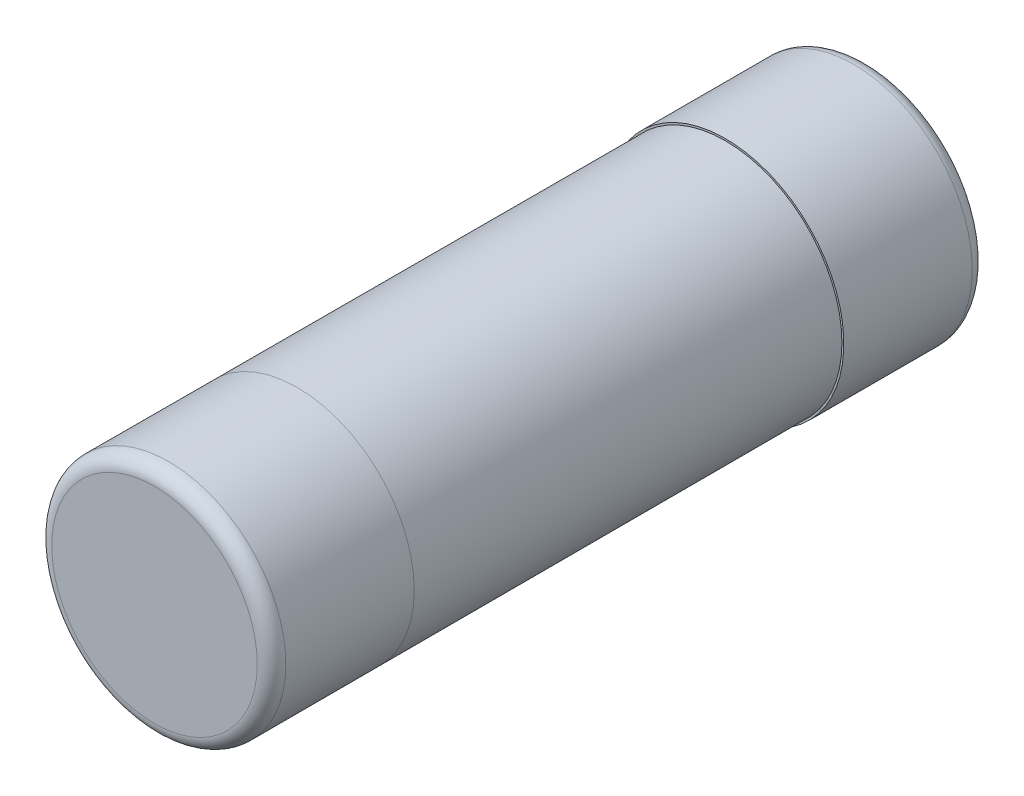
ISO-10303-21;
HEADER;
FILE_DESCRIPTION(('STEP AP214'),'2;1');
FILE_NAME('part.step','',(''),(''),'','','');
FILE_SCHEMA(('AUTOMOTIVE_DESIGN { 1 0 10303 214 1 1 1 1 }'));
ENDSEC;
DATA;
#1=APPLICATION_CONTEXT('core data for automotive mechanical design processes');
#2=APPLICATION_PROTOCOL_DEFINITION('international standard','automotive_design',2000,#1);
#3=PRODUCT_CONTEXT('',#1,'mechanical');
#4=PRODUCT('Part','Part','',(#3));
#5=PRODUCT_RELATED_PRODUCT_CATEGORY('part','',(#4));
#6=PRODUCT_DEFINITION_FORMATION('','',#4);
#7=PRODUCT_DEFINITION_CONTEXT('part definition',#1,'design');
#8=PRODUCT_DEFINITION('design','',#6,#7);
#9=PRODUCT_DEFINITION_SHAPE('','',#8);
#10=(LENGTH_UNIT() NAMED_UNIT(*) SI_UNIT(.MILLI.,.METRE.));
#11=(NAMED_UNIT(*) PLANE_ANGLE_UNIT() SI_UNIT($,.RADIAN.));
#12=(NAMED_UNIT(*) SI_UNIT($,.STERADIAN.) SOLID_ANGLE_UNIT());
#13=UNCERTAINTY_MEASURE_WITH_UNIT(LENGTH_MEASURE(1.E-05),#10,'distance_accuracy_value','');
#14=(GEOMETRIC_REPRESENTATION_CONTEXT(3) GLOBAL_UNCERTAINTY_ASSIGNED_CONTEXT((#13)) GLOBAL_UNIT_ASSIGNED_CONTEXT((#10,
#11,#12)) REPRESENTATION_CONTEXT('',''));
#15=CARTESIAN_POINT('',(0.,0.,0.));
#16=DIRECTION('',(0.,0.,1.));
#17=DIRECTION('',(1.,0.,0.));
#18=AXIS2_PLACEMENT_3D('',#15,#16,#17);
#19=CARTESIAN_POINT('',(0.,0.,9.));
#20=DIRECTION('',(0.,0.,-1.));
#21=DIRECTION('',(-1.,0.,0.));
#22=AXIS2_PLACEMENT_3D('',#19,#20,#21);
#23=CYLINDRICAL_SURFACE('',#22,2.45);
#24=CARTESIAN_POINT('',(0.,0.,9.));
#25=DIRECTION('',(0.,0.,1.));
#26=DIRECTION('',(1.,0.,0.));
#27=AXIS2_PLACEMENT_3D('',#24,#25,#26);
#28=CIRCLE('',#27,2.46);
#29=CARTESIAN_POINT('',(2.46,0.,9.));
#30=VERTEX_POINT('',#29);
#31=EDGE_CURVE('E51',#30,#30,#28,.T.);
#32=ORIENTED_EDGE('',*,*,#31,.F.);
#33=EDGE_LOOP('',(#32));
#34=FACE_BOUND('',#33,.T.);
#35=CARTESIAN_POINT('',(0.,0.,0.));
#36=DIRECTION('',(0.,0.,-1.));
#37=DIRECTION('',(-1.,0.,0.));
#38=AXIS2_PLACEMENT_3D('',#35,#36,#37);
#39=CIRCLE('',#38,2.45);
#40=CARTESIAN_POINT('',(-2.45,0.,0.));
#41=VERTEX_POINT('',#40);
#42=EDGE_CURVE('E91',#41,#41,#39,.T.);
#43=ORIENTED_EDGE('',*,*,#42,.F.);
#44=EDGE_LOOP('',(#43));
#45=FACE_BOUND('',#44,.T.);
#46=ADVANCED_FACE('F31',(#34,#45),#23,.T.);
#47=CARTESIAN_POINT('',(0.,0.,-3.));
#48=DIRECTION('',(0.,0.,1.));
#49=DIRECTION('',(1.,0.,0.));
#50=AXIS2_PLACEMENT_3D('',#47,#48,#49);
#51=CYLINDRICAL_SURFACE('',#50,2.49);
#52=CARTESIAN_POINT('',(0.,0.,-2.7));
#53=DIRECTION('',(0.,0.,-1.));
#54=DIRECTION('',(-1.,0.,0.));
#55=AXIS2_PLACEMENT_3D('',#52,#53,#54);
#56=CIRCLE('',#55,2.49);
#57=CARTESIAN_POINT('',(-2.49,0.,-2.7));
#58=VERTEX_POINT('',#57);
#59=EDGE_CURVE('E10',#58,#58,#56,.F.);
#60=ORIENTED_EDGE('',*,*,#59,.T.);
#61=EDGE_LOOP('',(#60));
#62=FACE_BOUND('',#61,.T.);
#63=CARTESIAN_POINT('',(0.,0.,0.));
#64=DIRECTION('',(0.,0.,-1.));
#65=DIRECTION('',(-1.,0.,0.));
#66=AXIS2_PLACEMENT_3D('',#63,#64,#65);
#67=CIRCLE('',#66,2.49);
#68=CARTESIAN_POINT('',(-2.49,0.,0.));
#69=VERTEX_POINT('',#68);
#70=EDGE_CURVE('E96',#69,#69,#67,.T.);
#71=ORIENTED_EDGE('',*,*,#70,.T.);
#72=EDGE_LOOP('',(#71));
#73=FACE_BOUND('',#72,.T.);
#74=ADVANCED_FACE('F66',(#62,#73),#51,.T.);
#75=CARTESIAN_POINT('',(0.,0.,-3.));
#76=DIRECTION('',(0.,0.,-1.));
#77=DIRECTION('',(-1.,0.,0.));
#78=AXIS2_PLACEMENT_3D('',#75,#76,#77);
#79=PLANE('',#78);
#80=CARTESIAN_POINT('',(0.,0.,-3.));
#81=DIRECTION('',(0.,0.,-1.));
#82=DIRECTION('',(-1.,0.,0.));
#83=AXIS2_PLACEMENT_3D('',#80,#81,#82);
#84=CIRCLE('',#83,2.19);
#85=CARTESIAN_POINT('',(-2.19,0.,-3.));
#86=VERTEX_POINT('',#85);
#87=EDGE_CURVE('E38',#86,#86,#84,.T.);
#88=ORIENTED_EDGE('',*,*,#87,.T.);
#89=EDGE_LOOP('',(#88));
#90=FACE_BOUND('',#89,.T.);
#91=ADVANCED_FACE('F104',(#90),#79,.T.);
#92=CARTESIAN_POINT('',(0.,0.,0.));
#93=DIRECTION('',(0.,0.,-1.));
#94=DIRECTION('',(-1.,0.,0.));
#95=AXIS2_PLACEMENT_3D('',#92,#93,#94);
#96=PLANE('',#95);
#97=ORIENTED_EDGE('',*,*,#42,.T.);
#98=EDGE_LOOP('',(#97));
#99=FACE_BOUND('',#98,.T.);
#100=ORIENTED_EDGE('',*,*,#70,.F.);
#101=EDGE_LOOP('',(#100));
#102=FACE_BOUND('',#101,.T.);
#103=ADVANCED_FACE('F87',(#99,#102),#96,.F.);
#104=CARTESIAN_POINT('',(0.,0.,12.));
#105=DIRECTION('',(0.,0.,-1.));
#106=DIRECTION('',(-1.,0.,0.));
#107=AXIS2_PLACEMENT_3D('',#104,#105,#106);
#108=CYLINDRICAL_SURFACE('',#107,2.46);
#109=CARTESIAN_POINT('',(0.,0.,11.7));
#110=DIRECTION('',(0.,0.,1.));
#111=DIRECTION('',(1.,0.,0.));
#112=AXIS2_PLACEMENT_3D('',#109,#110,#111);
#113=CIRCLE('',#112,2.46);
#114=CARTESIAN_POINT('',(2.46,0.,11.7));
#115=VERTEX_POINT('',#114);
#116=EDGE_CURVE('E42',#115,#115,#113,.F.);
#117=ORIENTED_EDGE('',*,*,#116,.T.);
#118=EDGE_LOOP('',(#117));
#119=FACE_BOUND('',#118,.T.);
#120=ORIENTED_EDGE('',*,*,#31,.T.);
#121=EDGE_LOOP('',(#120));
#122=FACE_BOUND('',#121,.T.);
#123=ADVANCED_FACE('F78',(#119,#122),#108,.T.);
#124=CARTESIAN_POINT('',(0.,0.,12.));
#125=DIRECTION('',(0.,0.,1.));
#126=DIRECTION('',(1.,0.,0.));
#127=AXIS2_PLACEMENT_3D('',#124,#125,#126);
#128=PLANE('',#127);
#129=CARTESIAN_POINT('',(0.,0.,12.));
#130=DIRECTION('',(0.,0.,1.));
#131=DIRECTION('',(1.,0.,0.));
#132=AXIS2_PLACEMENT_3D('',#129,#130,#131);
#133=CIRCLE('',#132,2.16);
#134=CARTESIAN_POINT('',(2.16,0.,12.));
#135=VERTEX_POINT('',#134);
#136=EDGE_CURVE('E46',#135,#135,#133,.T.);
#137=ORIENTED_EDGE('',*,*,#136,.T.);
#138=EDGE_LOOP('',(#137));
#139=FACE_BOUND('',#138,.T.);
#140=ADVANCED_FACE('F71',(#139),#128,.T.);
#141=CARTESIAN_POINT('',(0.,0.,11.7));
#142=DIRECTION('',(0.,0.,1.));
#143=DIRECTION('',(1.,0.,0.));
#144=AXIS2_PLACEMENT_3D('',#141,#142,#143);
#145=TOROIDAL_SURFACE('',#144,2.16,0.3);
#146=ORIENTED_EDGE('',*,*,#116,.F.);
#147=EDGE_LOOP('',(#146));
#148=FACE_BOUND('',#147,.T.);
#149=ORIENTED_EDGE('',*,*,#136,.F.);
#150=EDGE_LOOP('',(#149));
#151=FACE_BOUND('',#150,.T.);
#152=ADVANCED_FACE('F69',(#148,#151),#145,.T.);
#153=CARTESIAN_POINT('',(0.,0.,-2.7));
#154=DIRECTION('',(0.,0.,-1.));
#155=DIRECTION('',(-1.,0.,0.));
#156=AXIS2_PLACEMENT_3D('',#153,#154,#155);
#157=TOROIDAL_SURFACE('',#156,2.19,0.3);
#158=ORIENTED_EDGE('',*,*,#59,.F.);
#159=EDGE_LOOP('',(#158));
#160=FACE_BOUND('',#159,.T.);
#161=ORIENTED_EDGE('',*,*,#87,.F.);
#162=EDGE_LOOP('',(#161));
#163=FACE_BOUND('',#162,.T.);
#164=ADVANCED_FACE('F33',(#160,#163),#157,.T.);
#165=CLOSED_SHELL('',(#46,#74,#91,#103,#123,#140,#152,#164));
#166=MANIFOLD_SOLID_BREP('B2',#165);
#167=ADVANCED_BREP_SHAPE_REPRESENTATION('',(#18,#166),#14);
#168=SHAPE_DEFINITION_REPRESENTATION(#9,#167);
ENDSEC;
END-ISO-10303-21;
